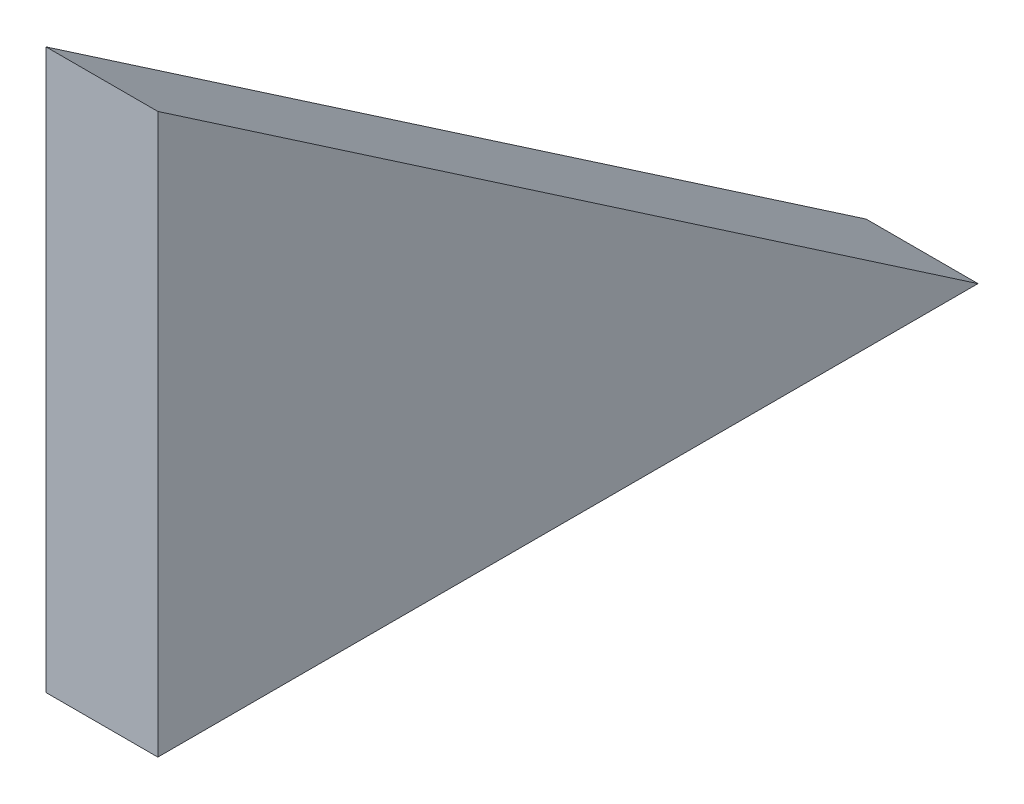
ISO-10303-21;
HEADER;
FILE_DESCRIPTION(('STEP AP214'),'2;1');
FILE_NAME('part.step','',(''),(''),'','','');
FILE_SCHEMA(('AUTOMOTIVE_DESIGN { 1 0 10303 214 1 1 1 1 }'));
ENDSEC;
DATA;
#1=APPLICATION_CONTEXT('core data for automotive mechanical design processes');
#2=APPLICATION_PROTOCOL_DEFINITION('international standard','automotive_design',2000,#1);
#3=PRODUCT_CONTEXT('',#1,'mechanical');
#4=PRODUCT('Part','Part','',(#3));
#5=PRODUCT_RELATED_PRODUCT_CATEGORY('part','',(#4));
#6=PRODUCT_DEFINITION_FORMATION('','',#4);
#7=PRODUCT_DEFINITION_CONTEXT('part definition',#1,'design');
#8=PRODUCT_DEFINITION('design','',#6,#7);
#9=PRODUCT_DEFINITION_SHAPE('','',#8);
#10=(LENGTH_UNIT() NAMED_UNIT(*) SI_UNIT(.MILLI.,.METRE.));
#11=(NAMED_UNIT(*) PLANE_ANGLE_UNIT() SI_UNIT($,.RADIAN.));
#12=(NAMED_UNIT(*) SI_UNIT($,.STERADIAN.) SOLID_ANGLE_UNIT());
#13=UNCERTAINTY_MEASURE_WITH_UNIT(LENGTH_MEASURE(1.E-05),#10,'distance_accuracy_value','');
#14=(GEOMETRIC_REPRESENTATION_CONTEXT(3) GLOBAL_UNCERTAINTY_ASSIGNED_CONTEXT((#13)) GLOBAL_UNIT_ASSIGNED_CONTEXT((#10,
#11,#12)) REPRESENTATION_CONTEXT('',''));
#15=CARTESIAN_POINT('',(0.,0.,0.));
#16=DIRECTION('',(0.,0.,1.));
#17=DIRECTION('',(1.,0.,0.));
#18=AXIS2_PLACEMENT_3D('',#15,#16,#17);
#19=CARTESIAN_POINT('',(3.,0.,-22.));
#20=DIRECTION('',(0.,1.,0.));
#21=DIRECTION('',(0.,0.,1.));
#22=AXIS2_PLACEMENT_3D('',#19,#20,#21);
#23=PLANE('',#22);
#24=DIRECTION('',(0.,0.,-1.));
#25=VECTOR('',#24,1.);
#26=CARTESIAN_POINT('',(0.,0.,-22.));
#27=LINE('',#26,#25);
#28=CARTESIAN_POINT('',(0.,0.,0.));
#29=VERTEX_POINT('',#28);
#30=CARTESIAN_POINT('',(0.,0.,-22.));
#31=VERTEX_POINT('',#30);
#32=EDGE_CURVE('E63',#29,#31,#27,.T.);
#33=ORIENTED_EDGE('',*,*,#32,.T.);
#34=DIRECTION('',(-1.,0.,0.));
#35=VECTOR('',#34,1.);
#36=CARTESIAN_POINT('',(3.,0.,-22.));
#37=LINE('',#36,#35);
#38=CARTESIAN_POINT('',(3.,0.,-22.));
#39=VERTEX_POINT('',#38);
#40=EDGE_CURVE('E41',#39,#31,#37,.T.);
#41=ORIENTED_EDGE('',*,*,#40,.F.);
#42=DIRECTION('',(0.,0.,-1.));
#43=VECTOR('',#42,1.);
#44=CARTESIAN_POINT('',(3.,0.,-22.));
#45=LINE('',#44,#43);
#46=CARTESIAN_POINT('',(3.,0.,0.));
#47=VERTEX_POINT('',#46);
#48=EDGE_CURVE('E71',#47,#39,#45,.T.);
#49=ORIENTED_EDGE('',*,*,#48,.F.);
#50=DIRECTION('',(-1.,0.,0.));
#51=VECTOR('',#50,1.);
#52=CARTESIAN_POINT('',(3.,0.,0.));
#53=LINE('',#52,#51);
#54=EDGE_CURVE('E11',#47,#29,#53,.T.);
#55=ORIENTED_EDGE('',*,*,#54,.T.);
#56=EDGE_LOOP('',(#33,#41,#49,#55));
#57=FACE_BOUND('',#56,.T.);
#58=ADVANCED_FACE('F33',(#57),#23,.F.);
#59=CARTESIAN_POINT('',(3.,15.,0.));
#60=DIRECTION('',(0.,-0.826227342807548,0.56333682464151));
#61=DIRECTION('',(0.,-0.56333682464151,-0.826227342807548));
#62=AXIS2_PLACEMENT_3D('',#59,#60,#61);
#63=PLANE('',#62);
#64=DIRECTION('',(0.,0.56333682464151,0.826227342807548));
#65=VECTOR('',#64,1.);
#66=CARTESIAN_POINT('',(0.,15.,0.));
#67=LINE('',#66,#65);
#68=CARTESIAN_POINT('',(0.,15.,0.));
#69=VERTEX_POINT('',#68);
#70=EDGE_CURVE('E69',#31,#69,#67,.T.);
#71=ORIENTED_EDGE('',*,*,#70,.T.);
#72=DIRECTION('',(-1.,0.,0.));
#73=VECTOR('',#72,1.);
#74=CARTESIAN_POINT('',(3.,15.,0.));
#75=LINE('',#74,#73);
#76=CARTESIAN_POINT('',(3.,15.,0.));
#77=VERTEX_POINT('',#76);
#78=EDGE_CURVE('E81',#77,#69,#75,.T.);
#79=ORIENTED_EDGE('',*,*,#78,.F.);
#80=DIRECTION('',(0.,0.56333682464151,0.826227342807548));
#81=VECTOR('',#80,1.);
#82=CARTESIAN_POINT('',(3.,15.,0.));
#83=LINE('',#82,#81);
#84=EDGE_CURVE('E74',#39,#77,#83,.T.);
#85=ORIENTED_EDGE('',*,*,#84,.F.);
#86=ORIENTED_EDGE('',*,*,#40,.T.);
#87=EDGE_LOOP('',(#71,#79,#85,#86));
#88=FACE_BOUND('',#87,.T.);
#89=ADVANCED_FACE('F89',(#88),#63,.F.);
#90=CARTESIAN_POINT('',(3.,9.9873015873015,0.));
#91=DIRECTION('',(0.,0.,-1.));
#92=DIRECTION('',(-1.,0.,0.));
#93=AXIS2_PLACEMENT_3D('',#90,#91,#92);
#94=PLANE('',#93);
#95=DIRECTION('',(0.,-1.,0.));
#96=VECTOR('',#95,1.);
#97=CARTESIAN_POINT('',(0.,9.9873015873015,0.));
#98=LINE('',#97,#96);
#99=EDGE_CURVE('E77',#69,#29,#98,.T.);
#100=ORIENTED_EDGE('',*,*,#99,.T.);
#101=ORIENTED_EDGE('',*,*,#54,.F.);
#102=DIRECTION('',(0.,-1.,0.));
#103=VECTOR('',#102,1.);
#104=CARTESIAN_POINT('',(3.,0.,0.));
#105=LINE('',#104,#103);
#106=EDGE_CURVE('E49',#77,#47,#105,.T.);
#107=ORIENTED_EDGE('',*,*,#106,.F.);
#108=ORIENTED_EDGE('',*,*,#78,.T.);
#109=EDGE_LOOP('',(#100,#101,#107,#108));
#110=FACE_BOUND('',#109,.T.);
#111=ADVANCED_FACE('F79',(#110),#94,.F.);
#112=CARTESIAN_POINT('',(3.,0.,0.));
#113=DIRECTION('',(1.,0.,0.));
#114=DIRECTION('',(0.,0.,-1.));
#115=AXIS2_PLACEMENT_3D('',#112,#113,#114);
#116=PLANE('',#115);
#117=ORIENTED_EDGE('',*,*,#106,.T.);
#118=ORIENTED_EDGE('',*,*,#48,.T.);
#119=ORIENTED_EDGE('',*,*,#84,.T.);
#120=EDGE_LOOP('',(#117,#118,#119));
#121=FACE_BOUND('',#120,.T.);
#122=ADVANCED_FACE('F76',(#121),#116,.T.);
#123=CARTESIAN_POINT('',(0.,0.,0.));
#124=DIRECTION('',(1.,0.,0.));
#125=DIRECTION('',(0.,0.,-1.));
#126=AXIS2_PLACEMENT_3D('',#123,#124,#125);
#127=PLANE('',#126);
#128=ORIENTED_EDGE('',*,*,#32,.F.);
#129=ORIENTED_EDGE('',*,*,#99,.F.);
#130=ORIENTED_EDGE('',*,*,#70,.F.);
#131=EDGE_LOOP('',(#128,#129,#130));
#132=FACE_BOUND('',#131,.T.);
#133=ADVANCED_FACE('F84',(#132),#127,.F.);
#134=CLOSED_SHELL('',(#58,#89,#111,#122,#133));
#135=MANIFOLD_SOLID_BREP('B2',#134);
#136=ADVANCED_BREP_SHAPE_REPRESENTATION('',(#18,#135),#14);
#137=SHAPE_DEFINITION_REPRESENTATION(#9,#136);
ENDSEC;
END-ISO-10303-21;
